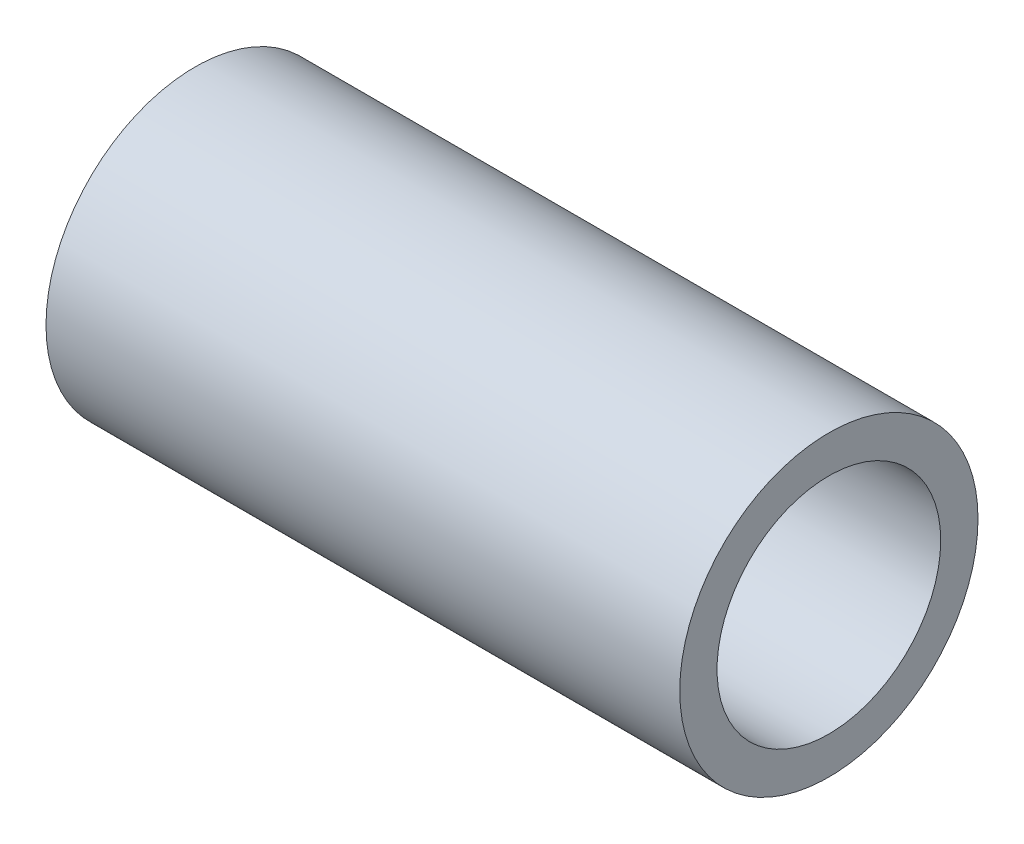
ISO-10303-21;
HEADER;
FILE_DESCRIPTION(('STEP AP214'),'2;1');
FILE_NAME('part.step','',(''),(''),'','','');
FILE_SCHEMA(('AUTOMOTIVE_DESIGN { 1 0 10303 214 1 1 1 1 }'));
ENDSEC;
DATA;
#1=APPLICATION_CONTEXT('core data for automotive mechanical design processes');
#2=APPLICATION_PROTOCOL_DEFINITION('international standard','automotive_design',2000,#1);
#3=PRODUCT_CONTEXT('',#1,'mechanical');
#4=PRODUCT('Part','Part','',(#3));
#5=PRODUCT_RELATED_PRODUCT_CATEGORY('part','',(#4));
#6=PRODUCT_DEFINITION_FORMATION('','',#4);
#7=PRODUCT_DEFINITION_CONTEXT('part definition',#1,'design');
#8=PRODUCT_DEFINITION('design','',#6,#7);
#9=PRODUCT_DEFINITION_SHAPE('','',#8);
#10=(LENGTH_UNIT() NAMED_UNIT(*) SI_UNIT(.MILLI.,.METRE.));
#11=(NAMED_UNIT(*) PLANE_ANGLE_UNIT() SI_UNIT($,.RADIAN.));
#12=(NAMED_UNIT(*) SI_UNIT($,.STERADIAN.) SOLID_ANGLE_UNIT());
#13=UNCERTAINTY_MEASURE_WITH_UNIT(LENGTH_MEASURE(1.E-05),#10,'distance_accuracy_value','');
#14=(GEOMETRIC_REPRESENTATION_CONTEXT(3) GLOBAL_UNCERTAINTY_ASSIGNED_CONTEXT((#13)) GLOBAL_UNIT_ASSIGNED_CONTEXT((#10,
#11,#12)) REPRESENTATION_CONTEXT('',''));
#15=CARTESIAN_POINT('',(0.,0.,0.));
#16=DIRECTION('',(0.,0.,1.));
#17=DIRECTION('',(1.,0.,0.));
#18=AXIS2_PLACEMENT_3D('',#15,#16,#17);
#19=CARTESIAN_POINT('',(17.,0.,0.));
#20=DIRECTION('',(1.,0.,0.));
#21=DIRECTION('',(0.,0.,-1.));
#22=AXIS2_PLACEMENT_3D('',#19,#20,#21);
#23=PLANE('',#22);
#24=CARTESIAN_POINT('',(17.,0.,0.));
#25=DIRECTION('',(1.,0.,0.));
#26=DIRECTION('',(0.,0.,-1.));
#27=AXIS2_PLACEMENT_3D('',#24,#25,#26);
#28=CIRCLE('',#27,4.);
#29=CARTESIAN_POINT('',(17.,0.,-4.));
#30=VERTEX_POINT('',#29);
#31=EDGE_CURVE('E10',#30,#30,#28,.T.);
#32=ORIENTED_EDGE('',*,*,#31,.T.);
#33=EDGE_LOOP('',(#32));
#34=FACE_BOUND('',#33,.T.);
#35=CARTESIAN_POINT('',(17.,0.,0.));
#36=DIRECTION('',(1.,0.,0.));
#37=DIRECTION('',(0.,0.,-1.));
#38=AXIS2_PLACEMENT_3D('',#35,#36,#37);
#39=CIRCLE('',#38,3.);
#40=CARTESIAN_POINT('',(17.,0.,-3.));
#41=VERTEX_POINT('',#40);
#42=EDGE_CURVE('E46',#41,#41,#39,.T.);
#43=ORIENTED_EDGE('',*,*,#42,.F.);
#44=EDGE_LOOP('',(#43));
#45=FACE_BOUND('',#44,.T.);
#46=ADVANCED_FACE('F35',(#34,#45),#23,.T.);
#47=CARTESIAN_POINT('',(0.,0.,0.));
#48=DIRECTION('',(1.,0.,0.));
#49=DIRECTION('',(0.,0.,-1.));
#50=AXIS2_PLACEMENT_3D('',#47,#48,#49);
#51=PLANE('',#50);
#52=CARTESIAN_POINT('',(0.,0.,0.));
#53=DIRECTION('',(1.,0.,0.));
#54=DIRECTION('',(0.,0.,-1.));
#55=AXIS2_PLACEMENT_3D('',#52,#53,#54);
#56=CIRCLE('',#55,4.);
#57=CARTESIAN_POINT('',(0.,0.,-4.));
#58=VERTEX_POINT('',#57);
#59=EDGE_CURVE('E39',#58,#58,#56,.T.);
#60=ORIENTED_EDGE('',*,*,#59,.F.);
#61=EDGE_LOOP('',(#60));
#62=FACE_BOUND('',#61,.T.);
#63=CARTESIAN_POINT('',(0.,0.,0.));
#64=DIRECTION('',(1.,0.,0.));
#65=DIRECTION('',(0.,0.,-1.));
#66=AXIS2_PLACEMENT_3D('',#63,#64,#65);
#67=CIRCLE('',#66,3.);
#68=CARTESIAN_POINT('',(0.,0.,-3.));
#69=VERTEX_POINT('',#68);
#70=EDGE_CURVE('E48',#69,#69,#67,.T.);
#71=ORIENTED_EDGE('',*,*,#70,.T.);
#72=EDGE_LOOP('',(#71));
#73=FACE_BOUND('',#72,.T.);
#74=ADVANCED_FACE('F58',(#62,#73),#51,.F.);
#75=CARTESIAN_POINT('',(17.,0.,0.));
#76=DIRECTION('',(-1.,0.,0.));
#77=DIRECTION('',(0.,0.,1.));
#78=AXIS2_PLACEMENT_3D('',#75,#76,#77);
#79=CYLINDRICAL_SURFACE('',#78,4.);
#80=ORIENTED_EDGE('',*,*,#31,.F.);
#81=EDGE_LOOP('',(#80));
#82=FACE_BOUND('',#81,.T.);
#83=ORIENTED_EDGE('',*,*,#59,.T.);
#84=EDGE_LOOP('',(#83));
#85=FACE_BOUND('',#84,.T.);
#86=ADVANCED_FACE('F37',(#82,#85),#79,.T.);
#87=CARTESIAN_POINT('',(17.,0.,0.));
#88=DIRECTION('',(-1.,0.,0.));
#89=DIRECTION('',(0.,0.,1.));
#90=AXIS2_PLACEMENT_3D('',#87,#88,#89);
#91=CYLINDRICAL_SURFACE('',#90,3.);
#92=ORIENTED_EDGE('',*,*,#42,.T.);
#93=EDGE_LOOP('',(#92));
#94=FACE_BOUND('',#93,.T.);
#95=ORIENTED_EDGE('',*,*,#70,.F.);
#96=EDGE_LOOP('',(#95));
#97=FACE_BOUND('',#96,.T.);
#98=ADVANCED_FACE('F54',(#94,#97),#91,.F.);
#99=CLOSED_SHELL('',(#46,#74,#86,#98));
#100=MANIFOLD_SOLID_BREP('B2',#99);
#101=ADVANCED_BREP_SHAPE_REPRESENTATION('',(#18,#100),#14);
#102=SHAPE_DEFINITION_REPRESENTATION(#9,#101);
ENDSEC;
END-ISO-10303-21;
